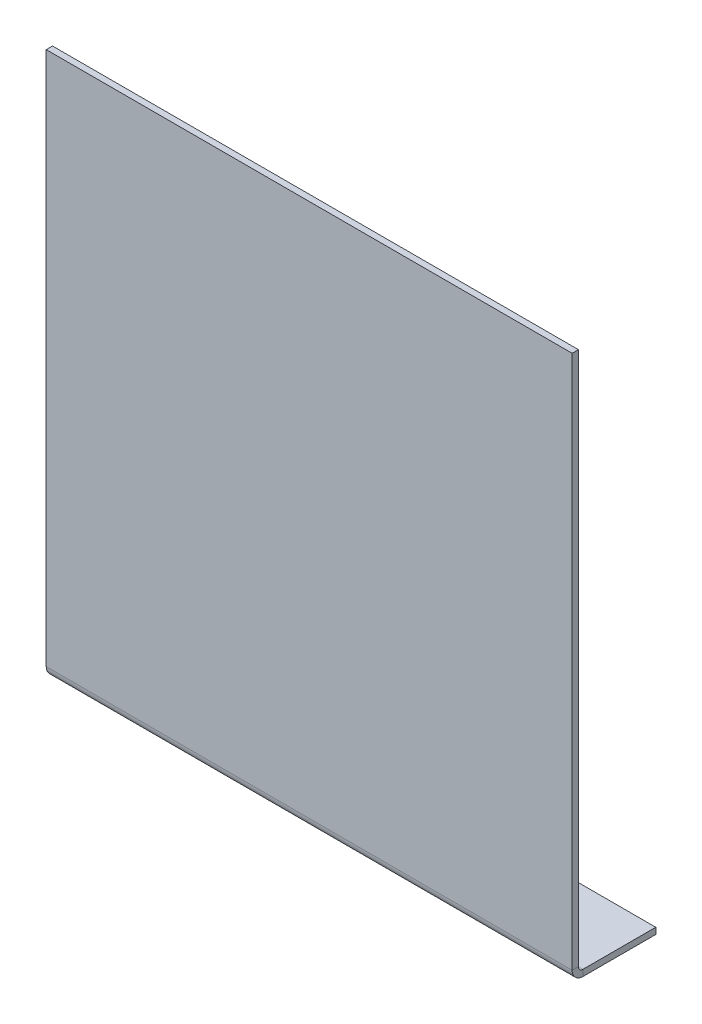
ISO-10303-21;
HEADER;
FILE_DESCRIPTION(('STEP AP214'),'2;1');
FILE_NAME('part.step','',(''),(''),'','','');
FILE_SCHEMA(('AUTOMOTIVE_DESIGN { 1 0 10303 214 1 1 1 1 }'));
ENDSEC;
DATA;
#1=APPLICATION_CONTEXT('core data for automotive mechanical design processes');
#2=APPLICATION_PROTOCOL_DEFINITION('international standard','automotive_design',2000,#1);
#3=PRODUCT_CONTEXT('',#1,'mechanical');
#4=PRODUCT('Part','Part','',(#3));
#5=PRODUCT_RELATED_PRODUCT_CATEGORY('part','',(#4));
#6=PRODUCT_DEFINITION_FORMATION('','',#4);
#7=PRODUCT_DEFINITION_CONTEXT('part definition',#1,'design');
#8=PRODUCT_DEFINITION('design','',#6,#7);
#9=PRODUCT_DEFINITION_SHAPE('','',#8);
#10=(LENGTH_UNIT() NAMED_UNIT(*) SI_UNIT(.MILLI.,.METRE.));
#11=(NAMED_UNIT(*) PLANE_ANGLE_UNIT() SI_UNIT($,.RADIAN.));
#12=(NAMED_UNIT(*) SI_UNIT($,.STERADIAN.) SOLID_ANGLE_UNIT());
#13=UNCERTAINTY_MEASURE_WITH_UNIT(LENGTH_MEASURE(1.E-05),#10,'distance_accuracy_value','');
#14=(GEOMETRIC_REPRESENTATION_CONTEXT(3) GLOBAL_UNCERTAINTY_ASSIGNED_CONTEXT((#13)) GLOBAL_UNIT_ASSIGNED_CONTEXT((#10,
#11,#12)) REPRESENTATION_CONTEXT('',''));
#15=CARTESIAN_POINT('',(0.,0.,0.));
#16=DIRECTION('',(0.,0.,1.));
#17=DIRECTION('',(1.,0.,0.));
#18=AXIS2_PLACEMENT_3D('',#15,#16,#17);
#19=CARTESIAN_POINT('',(0.,-12.9010083274639,13.5149916725362));
#20=DIRECTION('',(-1.,0.,0.));
#21=DIRECTION('',(0.,1.,0.));
#22=AXIS2_PLACEMENT_3D('',#19,#20,#21);
#23=PLANE('',#22);
#24=DIRECTION('',(0.,1.,0.));
#25=VECTOR('',#24,1.);
#26=CARTESIAN_POINT('',(0.,-12.9010083274639,12.4989916725362));
#27=LINE('',#26,#25);
#28=CARTESIAN_POINT('',(0.,0.7366,12.4989916725361));
#29=VERTEX_POINT('',#28);
#30=CARTESIAN_POINT('',(0.,87.0989916725361,12.4989916725358));
#31=VERTEX_POINT('',#30);
#32=EDGE_CURVE('E84',#29,#31,#27,.T.);
#33=ORIENTED_EDGE('',*,*,#32,.F.);
#34=DIRECTION('',(0.,0.,1.));
#35=VECTOR('',#34,1.);
#36=CARTESIAN_POINT('',(0.,0.736600000000004,13.5149916725361));
#37=LINE('',#36,#35);
#38=CARTESIAN_POINT('',(0.,0.736600000000008,13.5149916725361));
#39=VERTEX_POINT('',#38);
#40=EDGE_CURVE('E138',#29,#39,#37,.T.);
#41=ORIENTED_EDGE('',*,*,#40,.T.);
#42=DIRECTION('',(0.,1.,0.));
#43=VECTOR('',#42,1.);
#44=CARTESIAN_POINT('',(0.,-12.9010083274639,13.5149916725362));
#45=LINE('',#44,#43);
#46=CARTESIAN_POINT('',(0.,87.0989916725361,13.5149916725358));
#47=VERTEX_POINT('',#46);
#48=EDGE_CURVE('E58',#39,#47,#45,.T.);
#49=ORIENTED_EDGE('',*,*,#48,.T.);
#50=DIRECTION('',(0.,0.,-1.));
#51=VECTOR('',#50,1.);
#52=CARTESIAN_POINT('',(0.,87.0989916725361,13.5149916725358));
#53=LINE('',#52,#51);
#54=EDGE_CURVE('E244',#47,#31,#53,.T.);
#55=ORIENTED_EDGE('',*,*,#54,.T.);
#56=EDGE_LOOP('',(#33,#41,#49,#55));
#57=FACE_BOUND('',#56,.T.);
#58=ADVANCED_FACE('F54',(#57),#23,.T.);
#59=CARTESIAN_POINT('',(85.,-12.9010083274639,13.5149916725362));
#60=DIRECTION('',(1.,0.,0.));
#61=DIRECTION('',(0.,-1.,0.));
#62=AXIS2_PLACEMENT_3D('',#59,#60,#61);
#63=PLANE('',#62);
#64=DIRECTION('',(0.,-1.,0.));
#65=VECTOR('',#64,1.);
#66=CARTESIAN_POINT('',(85.,-12.9010083274639,13.5149916725362));
#67=LINE('',#66,#65);
#68=CARTESIAN_POINT('',(85.,87.0989916725361,13.5149916725358));
#69=VERTEX_POINT('',#68);
#70=CARTESIAN_POINT('',(85.,0.736600000000002,13.5149916725361));
#71=VERTEX_POINT('',#70);
#72=EDGE_CURVE('E239',#69,#71,#67,.T.);
#73=ORIENTED_EDGE('',*,*,#72,.T.);
#74=DIRECTION('',(0.,0.,-1.));
#75=VECTOR('',#74,1.);
#76=CARTESIAN_POINT('',(85.,0.736600000000004,13.5149916725361));
#77=LINE('',#76,#75);
#78=CARTESIAN_POINT('',(85.,0.7366,12.4989916725361));
#79=VERTEX_POINT('',#78);
#80=EDGE_CURVE('E12',#71,#79,#77,.T.);
#81=ORIENTED_EDGE('',*,*,#80,.T.);
#82=DIRECTION('',(0.,-1.,0.));
#83=VECTOR('',#82,1.);
#84=CARTESIAN_POINT('',(85.,-12.9010083274639,12.4989916725362));
#85=LINE('',#84,#83);
#86=CARTESIAN_POINT('',(85.,87.0989916725361,12.4989916725358));
#87=VERTEX_POINT('',#86);
#88=EDGE_CURVE('E75',#87,#79,#85,.T.);
#89=ORIENTED_EDGE('',*,*,#88,.F.);
#90=DIRECTION('',(0.,0.,-1.));
#91=VECTOR('',#90,1.);
#92=CARTESIAN_POINT('',(85.,87.0989916725361,13.5149916725358));
#93=LINE('',#92,#91);
#94=EDGE_CURVE('E165',#69,#87,#93,.T.);
#95=ORIENTED_EDGE('',*,*,#94,.F.);
#96=EDGE_LOOP('',(#73,#81,#89,#95));
#97=FACE_BOUND('',#96,.T.);
#98=ADVANCED_FACE('F56',(#97),#63,.T.);
#99=CARTESIAN_POINT('',(0.,-12.9010083274639,12.4989916725362));
#100=DIRECTION('',(0.,0.,-1.));
#101=DIRECTION('',(0.,1.,0.));
#102=AXIS2_PLACEMENT_3D('',#99,#100,#101);
#103=PLANE('',#102);
#104=ORIENTED_EDGE('',*,*,#88,.T.);
#105=DIRECTION('',(-1.,0.,0.));
#106=VECTOR('',#105,1.);
#107=CARTESIAN_POINT('',(0.,0.7366,12.4989916725361));
#108=LINE('',#107,#106);
#109=EDGE_CURVE('E63',#79,#29,#108,.T.);
#110=ORIENTED_EDGE('',*,*,#109,.T.);
#111=ORIENTED_EDGE('',*,*,#32,.T.);
#112=DIRECTION('',(1.,0.,0.));
#113=VECTOR('',#112,1.);
#114=CARTESIAN_POINT('',(0.,87.0989916725361,12.4989916725358));
#115=LINE('',#114,#113);
#116=EDGE_CURVE('E240',#31,#87,#115,.T.);
#117=ORIENTED_EDGE('',*,*,#116,.T.);
#118=EDGE_LOOP('',(#104,#110,#111,#117));
#119=FACE_BOUND('',#118,.T.);
#120=ADVANCED_FACE('F275',(#119),#103,.T.);
#121=CARTESIAN_POINT('',(0.,87.0989916725361,13.5149916725358));
#122=DIRECTION('',(0.,1.,0.));
#123=DIRECTION('',(1.,0.,0.));
#124=AXIS2_PLACEMENT_3D('',#121,#122,#123);
#125=PLANE('',#124);
#126=ORIENTED_EDGE('',*,*,#116,.F.);
#127=ORIENTED_EDGE('',*,*,#54,.F.);
#128=DIRECTION('',(1.,0.,0.));
#129=VECTOR('',#128,1.);
#130=CARTESIAN_POINT('',(0.,87.0989916725361,13.5149916725358));
#131=LINE('',#130,#129);
#132=EDGE_CURVE('E154',#47,#69,#131,.T.);
#133=ORIENTED_EDGE('',*,*,#132,.T.);
#134=ORIENTED_EDGE('',*,*,#94,.T.);
#135=EDGE_LOOP('',(#126,#127,#133,#134));
#136=FACE_BOUND('',#135,.T.);
#137=ADVANCED_FACE('F279',(#136),#125,.T.);
#138=CARTESIAN_POINT('',(0.,-12.9010083274639,13.5149916725362));
#139=DIRECTION('',(0.,0.,-1.));
#140=DIRECTION('',(0.,1.,0.));
#141=AXIS2_PLACEMENT_3D('',#138,#139,#140);
#142=PLANE('',#141);
#143=DIRECTION('',(-1.,0.,0.));
#144=VECTOR('',#143,1.);
#145=CARTESIAN_POINT('',(0.,0.736600000000004,13.5149916725361));
#146=LINE('',#145,#144);
#147=EDGE_CURVE('E145',#71,#39,#146,.T.);
#148=ORIENTED_EDGE('',*,*,#147,.F.);
#149=ORIENTED_EDGE('',*,*,#72,.F.);
#150=ORIENTED_EDGE('',*,*,#132,.F.);
#151=ORIENTED_EDGE('',*,*,#48,.F.);
#152=EDGE_LOOP('',(#148,#149,#150,#151));
#153=FACE_BOUND('',#152,.T.);
#154=ADVANCED_FACE('F150',(#153),#142,.F.);
#155=CARTESIAN_POINT('',(0.,-1.016,0.));
#156=DIRECTION('',(0.,0.,-1.));
#157=DIRECTION('',(-1.,0.,0.));
#158=AXIS2_PLACEMENT_3D('',#155,#156,#157);
#159=PLANE('',#158);
#160=DIRECTION('',(-1.,0.,0.));
#161=VECTOR('',#160,1.);
#162=CARTESIAN_POINT('',(0.,0.,0.));
#163=LINE('',#162,#161);
#164=CARTESIAN_POINT('',(85.,0.,0.));
#165=VERTEX_POINT('',#164);
#166=CARTESIAN_POINT('',(0.,0.,0.));
#167=VERTEX_POINT('',#166);
#168=EDGE_CURVE('E198',#165,#167,#163,.T.);
#169=ORIENTED_EDGE('',*,*,#168,.F.);
#170=DIRECTION('',(0.,1.,0.));
#171=VECTOR('',#170,1.);
#172=CARTESIAN_POINT('',(85.,-1.016,0.));
#173=LINE('',#172,#171);
#174=CARTESIAN_POINT('',(85.,-1.016,0.));
#175=VERTEX_POINT('',#174);
#176=EDGE_CURVE('E189',#175,#165,#173,.T.);
#177=ORIENTED_EDGE('',*,*,#176,.F.);
#178=DIRECTION('',(-1.,0.,0.));
#179=VECTOR('',#178,1.);
#180=CARTESIAN_POINT('',(0.,-1.016,0.));
#181=LINE('',#180,#179);
#182=CARTESIAN_POINT('',(0.,-1.016,0.));
#183=VERTEX_POINT('',#182);
#184=EDGE_CURVE('E229',#175,#183,#181,.T.);
#185=ORIENTED_EDGE('',*,*,#184,.T.);
#186=DIRECTION('',(0.,1.,0.));
#187=VECTOR('',#186,1.);
#188=CARTESIAN_POINT('',(0.,-1.016,0.));
#189=LINE('',#188,#187);
#190=EDGE_CURVE('E227',#183,#167,#189,.T.);
#191=ORIENTED_EDGE('',*,*,#190,.T.);
#192=EDGE_LOOP('',(#169,#177,#185,#191));
#193=FACE_BOUND('',#192,.T.);
#194=ADVANCED_FACE('F304',(#193),#159,.T.);
#195=CARTESIAN_POINT('',(10.,-1.016,7.));
#196=DIRECTION('',(0.,1.,0.));
#197=DIRECTION('',(0.,0.,1.));
#198=AXIS2_PLACEMENT_3D('',#195,#196,#197);
#199=CYLINDRICAL_SURFACE('',#198,1.4732);
#200=CARTESIAN_POINT('',(10.,-1.016,7.));
#201=DIRECTION('',(0.,1.,0.));
#202=DIRECTION('',(0.,0.,1.));
#203=AXIS2_PLACEMENT_3D('',#200,#201,#202);
#204=CIRCLE('',#203,1.4732);
#205=CARTESIAN_POINT('',(10.,-1.016,8.4732));
#206=VERTEX_POINT('',#205);
#207=EDGE_CURVE('E211',#206,#206,#204,.T.);
#208=ORIENTED_EDGE('',*,*,#207,.F.);
#209=EDGE_LOOP('',(#208));
#210=FACE_BOUND('',#209,.T.);
#211=CARTESIAN_POINT('',(10.,0.,7.));
#212=DIRECTION('',(0.,1.,0.));
#213=DIRECTION('',(0.,0.,1.));
#214=AXIS2_PLACEMENT_3D('',#211,#212,#213);
#215=CIRCLE('',#214,1.4732);
#216=CARTESIAN_POINT('',(10.,0.,8.4732));
#217=VERTEX_POINT('',#216);
#218=EDGE_CURVE('E223',#217,#217,#215,.T.);
#219=ORIENTED_EDGE('',*,*,#218,.T.);
#220=EDGE_LOOP('',(#219));
#221=FACE_BOUND('',#220,.T.);
#222=ADVANCED_FACE('F306',(#210,#221),#199,.F.);
#223=CARTESIAN_POINT('',(75.,-1.016,7.));
#224=DIRECTION('',(0.,1.,0.));
#225=DIRECTION('',(0.,0.,1.));
#226=AXIS2_PLACEMENT_3D('',#223,#224,#225);
#227=CYLINDRICAL_SURFACE('',#226,1.4732);
#228=CARTESIAN_POINT('',(75.,-1.016,7.));
#229=DIRECTION('',(0.,1.,0.));
#230=DIRECTION('',(0.,0.,1.));
#231=AXIS2_PLACEMENT_3D('',#228,#229,#230);
#232=CIRCLE('',#231,1.4732);
#233=CARTESIAN_POINT('',(75.,-1.016,8.4732));
#234=VERTEX_POINT('',#233);
#235=EDGE_CURVE('E215',#234,#234,#232,.T.);
#236=ORIENTED_EDGE('',*,*,#235,.F.);
#237=EDGE_LOOP('',(#236));
#238=FACE_BOUND('',#237,.T.);
#239=CARTESIAN_POINT('',(75.,0.,7.));
#240=DIRECTION('',(0.,1.,0.));
#241=DIRECTION('',(0.,0.,1.));
#242=AXIS2_PLACEMENT_3D('',#239,#240,#241);
#243=CIRCLE('',#242,1.4732);
#244=CARTESIAN_POINT('',(75.,0.,8.4732));
#245=VERTEX_POINT('',#244);
#246=EDGE_CURVE('E219',#245,#245,#243,.T.);
#247=ORIENTED_EDGE('',*,*,#246,.T.);
#248=EDGE_LOOP('',(#247));
#249=FACE_BOUND('',#248,.T.);
#250=ADVANCED_FACE('F312',(#238,#249),#227,.F.);
#251=CARTESIAN_POINT('',(0.,-1.016,0.));
#252=DIRECTION('',(0.,1.,0.));
#253=DIRECTION('',(0.,0.,1.));
#254=AXIS2_PLACEMENT_3D('',#251,#252,#253);
#255=PLANE('',#254);
#256=ORIENTED_EDGE('',*,*,#235,.T.);
#257=EDGE_LOOP('',(#256));
#258=FACE_BOUND('',#257,.T.);
#259=ORIENTED_EDGE('',*,*,#207,.T.);
#260=EDGE_LOOP('',(#259));
#261=FACE_BOUND('',#260,.T.);
#262=DIRECTION('',(0.,0.,-1.));
#263=VECTOR('',#262,1.);
#264=CARTESIAN_POINT('',(85.,-1.016,0.));
#265=LINE('',#264,#263);
#266=CARTESIAN_POINT('',(85.,-1.016,11.7623916725361));
#267=VERTEX_POINT('',#266);
#268=EDGE_CURVE('E192',#267,#175,#265,.T.);
#269=ORIENTED_EDGE('',*,*,#268,.F.);
#270=DIRECTION('',(-1.,0.,0.));
#271=VECTOR('',#270,1.);
#272=CARTESIAN_POINT('',(0.,-1.016,11.7623916725361));
#273=LINE('',#272,#271);
#274=CARTESIAN_POINT('',(0.,-1.016,11.7623916725361));
#275=VERTEX_POINT('',#274);
#276=EDGE_CURVE('E207',#267,#275,#273,.T.);
#277=ORIENTED_EDGE('',*,*,#276,.T.);
#278=DIRECTION('',(0.,0.,1.));
#279=VECTOR('',#278,1.);
#280=CARTESIAN_POINT('',(0.,-1.016,0.));
#281=LINE('',#280,#279);
#282=EDGE_CURVE('E204',#183,#275,#281,.T.);
#283=ORIENTED_EDGE('',*,*,#282,.F.);
#284=ORIENTED_EDGE('',*,*,#184,.F.);
#285=EDGE_LOOP('',(#269,#277,#283,#284));
#286=FACE_BOUND('',#285,.T.);
#287=ADVANCED_FACE('F302',(#258,#261,#286),#255,.F.);
#288=CARTESIAN_POINT('',(0.,-1.016,0.));
#289=DIRECTION('',(-1.,0.,0.));
#290=DIRECTION('',(0.,0.,1.));
#291=AXIS2_PLACEMENT_3D('',#288,#289,#290);
#292=PLANE('',#291);
#293=DIRECTION('',(0.,-1.,0.));
#294=VECTOR('',#293,1.);
#295=CARTESIAN_POINT('',(0.,-1.016,11.7623916725361));
#296=LINE('',#295,#294);
#297=CARTESIAN_POINT('',(0.,0.,11.7623916725361));
#298=VERTEX_POINT('',#297);
#299=EDGE_CURVE('E170',#298,#275,#296,.T.);
#300=ORIENTED_EDGE('',*,*,#299,.F.);
#301=DIRECTION('',(0.,0.,1.));
#302=VECTOR('',#301,1.);
#303=CARTESIAN_POINT('',(0.,0.,0.));
#304=LINE('',#303,#302);
#305=EDGE_CURVE('E195',#167,#298,#304,.T.);
#306=ORIENTED_EDGE('',*,*,#305,.F.);
#307=ORIENTED_EDGE('',*,*,#190,.F.);
#308=ORIENTED_EDGE('',*,*,#282,.T.);
#309=EDGE_LOOP('',(#300,#306,#307,#308));
#310=FACE_BOUND('',#309,.T.);
#311=ADVANCED_FACE('F298',(#310),#292,.T.);
#312=CARTESIAN_POINT('',(0.,0.,0.));
#313=DIRECTION('',(0.,1.,0.));
#314=DIRECTION('',(0.,0.,1.));
#315=AXIS2_PLACEMENT_3D('',#312,#313,#314);
#316=PLANE('',#315);
#317=DIRECTION('',(-1.,0.,0.));
#318=VECTOR('',#317,1.);
#319=CARTESIAN_POINT('',(0.,0.,11.7623916725361));
#320=LINE('',#319,#318);
#321=CARTESIAN_POINT('',(85.,0.,11.7623916725361));
#322=VERTEX_POINT('',#321);
#323=EDGE_CURVE('E178',#322,#298,#320,.T.);
#324=ORIENTED_EDGE('',*,*,#323,.F.);
#325=DIRECTION('',(0.,0.,-1.));
#326=VECTOR('',#325,1.);
#327=CARTESIAN_POINT('',(85.,0.,0.));
#328=LINE('',#327,#326);
#329=EDGE_CURVE('E201',#322,#165,#328,.T.);
#330=ORIENTED_EDGE('',*,*,#329,.T.);
#331=ORIENTED_EDGE('',*,*,#168,.T.);
#332=ORIENTED_EDGE('',*,*,#305,.T.);
#333=EDGE_LOOP('',(#324,#330,#331,#332));
#334=FACE_BOUND('',#333,.T.);
#335=ORIENTED_EDGE('',*,*,#246,.F.);
#336=EDGE_LOOP('',(#335));
#337=FACE_BOUND('',#336,.T.);
#338=ORIENTED_EDGE('',*,*,#218,.F.);
#339=EDGE_LOOP('',(#338));
#340=FACE_BOUND('',#339,.T.);
#341=ADVANCED_FACE('F294',(#334,#337,#340),#316,.T.);
#342=CARTESIAN_POINT('',(85.,-1.016,0.));
#343=DIRECTION('',(1.,0.,0.));
#344=DIRECTION('',(0.,0.,-1.));
#345=AXIS2_PLACEMENT_3D('',#342,#343,#344);
#346=PLANE('',#345);
#347=DIRECTION('',(0.,1.,0.));
#348=VECTOR('',#347,1.);
#349=CARTESIAN_POINT('',(85.,-1.016,11.7623916725361));
#350=LINE('',#349,#348);
#351=EDGE_CURVE('E172',#267,#322,#350,.T.);
#352=ORIENTED_EDGE('',*,*,#351,.F.);
#353=ORIENTED_EDGE('',*,*,#268,.T.);
#354=ORIENTED_EDGE('',*,*,#176,.T.);
#355=ORIENTED_EDGE('',*,*,#329,.F.);
#356=EDGE_LOOP('',(#352,#353,#354,#355));
#357=FACE_BOUND('',#356,.T.);
#358=ADVANCED_FACE('F289',(#357),#346,.T.);
#359=CARTESIAN_POINT('',(85.,0.7366,11.7623916725361));
#360=DIRECTION('',(1.,0.,0.));
#361=DIRECTION('',(0.,0.,-1.));
#362=AXIS2_PLACEMENT_3D('',#359,#360,#361);
#363=PLANE('',#362);
#364=ORIENTED_EDGE('',*,*,#351,.T.);
#365=CARTESIAN_POINT('',(85.,0.7366,11.7623916725361));
#366=DIRECTION('',(-1.,0.,0.));
#367=DIRECTION('',(0.,0.,1.));
#368=AXIS2_PLACEMENT_3D('',#365,#366,#367);
#369=CIRCLE('',#368,0.7366);
#370=EDGE_CURVE('E185',#322,#79,#369,.T.);
#371=ORIENTED_EDGE('',*,*,#370,.T.);
#372=ORIENTED_EDGE('',*,*,#80,.F.);
#373=CARTESIAN_POINT('',(85.,0.7366,11.7623916725361));
#374=DIRECTION('',(-1.,0.,0.));
#375=DIRECTION('',(0.,0.,-1.));
#376=AXIS2_PLACEMENT_3D('',#373,#374,#375);
#377=CIRCLE('',#376,1.7526);
#378=EDGE_CURVE('E163',#267,#71,#377,.T.);
#379=ORIENTED_EDGE('',*,*,#378,.F.);
#380=EDGE_LOOP('',(#364,#371,#372,#379));
#381=FACE_BOUND('',#380,.T.);
#382=ADVANCED_FACE('F286',(#381),#363,.T.);
#383=CARTESIAN_POINT('',(0.,0.7366,11.7623916725361));
#384=DIRECTION('',(-1.,0.,0.));
#385=DIRECTION('',(0.,0.,1.));
#386=AXIS2_PLACEMENT_3D('',#383,#384,#385);
#387=PLANE('',#386);
#388=ORIENTED_EDGE('',*,*,#40,.F.);
#389=CARTESIAN_POINT('',(0.,0.7366,11.7623916725361));
#390=DIRECTION('',(-1.,0.,0.));
#391=DIRECTION('',(0.,0.,1.));
#392=AXIS2_PLACEMENT_3D('',#389,#390,#391);
#393=CIRCLE('',#392,0.7366);
#394=EDGE_CURVE('E181',#29,#298,#393,.F.);
#395=ORIENTED_EDGE('',*,*,#394,.T.);
#396=ORIENTED_EDGE('',*,*,#299,.T.);
#397=CARTESIAN_POINT('',(0.,0.7366,11.7623916725361));
#398=DIRECTION('',(1.,0.,0.));
#399=DIRECTION('',(0.,0.,1.));
#400=AXIS2_PLACEMENT_3D('',#397,#398,#399);
#401=CIRCLE('',#400,1.7526);
#402=EDGE_CURVE('E161',#39,#275,#401,.T.);
#403=ORIENTED_EDGE('',*,*,#402,.F.);
#404=EDGE_LOOP('',(#388,#395,#396,#403));
#405=FACE_BOUND('',#404,.T.);
#406=ADVANCED_FACE('F168',(#405),#387,.T.);
#407=CARTESIAN_POINT('',(127.52675281053,0.7366,11.7623916725361));
#408=DIRECTION('',(-1.,0.,0.));
#409=DIRECTION('',(0.,0.,1.));
#410=AXIS2_PLACEMENT_3D('',#407,#408,#409);
#411=CYLINDRICAL_SURFACE('',#410,1.7526);
#412=ORIENTED_EDGE('',*,*,#402,.T.);
#413=ORIENTED_EDGE('',*,*,#276,.F.);
#414=ORIENTED_EDGE('',*,*,#378,.T.);
#415=ORIENTED_EDGE('',*,*,#147,.T.);
#416=EDGE_LOOP('',(#412,#413,#414,#415));
#417=FACE_BOUND('',#416,.T.);
#418=ADVANCED_FACE('F159',(#417),#411,.T.);
#419=CARTESIAN_POINT('',(127.52675281053,0.7366,11.7623916725361));
#420=DIRECTION('',(-1.,0.,0.));
#421=DIRECTION('',(0.,0.,1.));
#422=AXIS2_PLACEMENT_3D('',#419,#420,#421);
#423=CYLINDRICAL_SURFACE('',#422,0.7366);
#424=ORIENTED_EDGE('',*,*,#394,.F.);
#425=ORIENTED_EDGE('',*,*,#109,.F.);
#426=ORIENTED_EDGE('',*,*,#370,.F.);
#427=ORIENTED_EDGE('',*,*,#323,.T.);
#428=EDGE_LOOP('',(#424,#425,#426,#427));
#429=FACE_BOUND('',#428,.T.);
#430=ADVANCED_FACE('F285',(#429),#423,.F.);
#431=CLOSED_SHELL('',(#58,#98,#120,#137,#154,#194,#222,#250,#287,#311,#341,#358,#382,#406,#418,#430));
#432=MANIFOLD_SOLID_BREP('B2',#431);
#433=ADVANCED_BREP_SHAPE_REPRESENTATION('',(#18,#432),#14);
#434=SHAPE_DEFINITION_REPRESENTATION(#9,#433);
ENDSEC;
END-ISO-10303-21;
